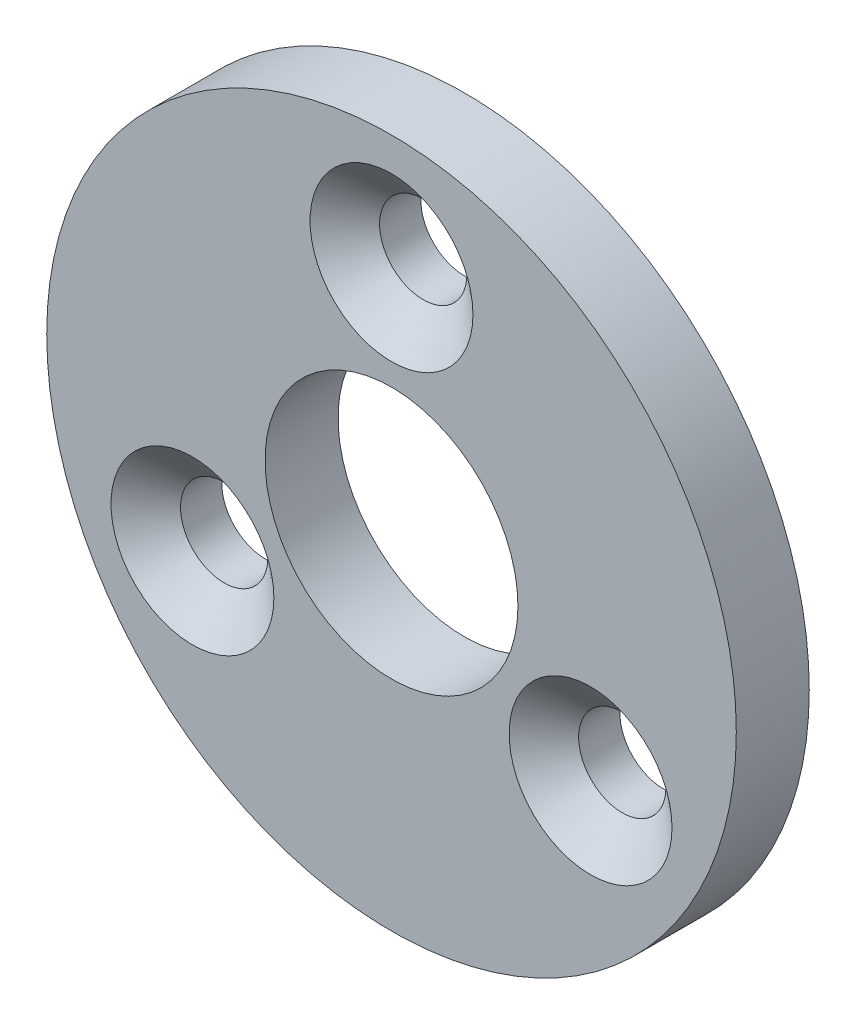
ISO-10303-21;
HEADER;
FILE_DESCRIPTION(('STEP AP214'),'2;1');
FILE_NAME('part.step','',(''),(''),'','','');
FILE_SCHEMA(('AUTOMOTIVE_DESIGN { 1 0 10303 214 1 1 1 1 }'));
ENDSEC;
DATA;
#1=APPLICATION_CONTEXT('core data for automotive mechanical design processes');
#2=APPLICATION_PROTOCOL_DEFINITION('international standard','automotive_design',2000,#1);
#3=PRODUCT_CONTEXT('',#1,'mechanical');
#4=PRODUCT('Part','Part','',(#3));
#5=PRODUCT_RELATED_PRODUCT_CATEGORY('part','',(#4));
#6=PRODUCT_DEFINITION_FORMATION('','',#4);
#7=PRODUCT_DEFINITION_CONTEXT('part definition',#1,'design');
#8=PRODUCT_DEFINITION('design','',#6,#7);
#9=PRODUCT_DEFINITION_SHAPE('','',#8);
#10=(LENGTH_UNIT() NAMED_UNIT(*) SI_UNIT(.MILLI.,.METRE.));
#11=(NAMED_UNIT(*) PLANE_ANGLE_UNIT() SI_UNIT($,.RADIAN.));
#12=(NAMED_UNIT(*) SI_UNIT($,.STERADIAN.) SOLID_ANGLE_UNIT());
#13=UNCERTAINTY_MEASURE_WITH_UNIT(LENGTH_MEASURE(1.E-05),#10,'distance_accuracy_value','');
#14=(GEOMETRIC_REPRESENTATION_CONTEXT(3) GLOBAL_UNCERTAINTY_ASSIGNED_CONTEXT((#13)) GLOBAL_UNIT_ASSIGNED_CONTEXT((#10,
#11,#12)) REPRESENTATION_CONTEXT('',''));
#15=CARTESIAN_POINT('',(0.,0.,0.));
#16=DIRECTION('',(0.,0.,1.));
#17=DIRECTION('',(1.,0.,0.));
#18=AXIS2_PLACEMENT_3D('',#15,#16,#17);
#19=CARTESIAN_POINT('',(0.,0.,3.175));
#20=DIRECTION('',(0.,0.,1.));
#21=DIRECTION('',(1.,0.,0.));
#22=AXIS2_PLACEMENT_3D('',#19,#20,#21);
#23=PLANE('',#22);
#24=CARTESIAN_POINT('',(0.,10.,3.175));
#25=DIRECTION('',(0.,0.,1.));
#26=DIRECTION('',(1.,0.,0.));
#27=AXIS2_PLACEMENT_3D('',#24,#25,#26);
#28=CIRCLE('',#27,3.5433);
#29=CARTESIAN_POINT('',(3.5433,10.,3.175));
#30=VERTEX_POINT('',#29);
#31=EDGE_CURVE('E72',#30,#30,#28,.T.);
#32=ORIENTED_EDGE('',*,*,#31,.F.);
#33=EDGE_LOOP('',(#32));
#34=FACE_BOUND('',#33,.T.);
#35=CARTESIAN_POINT('',(-8.6602540378444,-4.99999999999998,3.175));
#36=DIRECTION('',(0.,0.,1.));
#37=DIRECTION('',(1.,0.,0.));
#38=AXIS2_PLACEMENT_3D('',#35,#36,#37);
#39=CIRCLE('',#38,3.5433);
#40=CARTESIAN_POINT('',(-5.1169540378444,-4.99999999999998,3.175));
#41=VERTEX_POINT('',#40);
#42=EDGE_CURVE('E63',#41,#41,#39,.T.);
#43=ORIENTED_EDGE('',*,*,#42,.F.);
#44=EDGE_LOOP('',(#43));
#45=FACE_BOUND('',#44,.T.);
#46=CARTESIAN_POINT('',(8.6602540378444,-4.99999999999998,3.175));
#47=DIRECTION('',(0.,0.,1.));
#48=DIRECTION('',(1.,0.,0.));
#49=AXIS2_PLACEMENT_3D('',#46,#47,#48);
#50=CIRCLE('',#49,3.5433);
#51=CARTESIAN_POINT('',(12.2035540378444,-4.99999999999998,3.175));
#52=VERTEX_POINT('',#51);
#53=EDGE_CURVE('E54',#52,#52,#50,.T.);
#54=ORIENTED_EDGE('',*,*,#53,.F.);
#55=EDGE_LOOP('',(#54));
#56=FACE_BOUND('',#55,.T.);
#57=CARTESIAN_POINT('',(0.,0.,3.175));
#58=DIRECTION('',(0.,0.,1.));
#59=DIRECTION('',(1.,0.,0.));
#60=AXIS2_PLACEMENT_3D('',#57,#58,#59);
#61=CIRCLE('',#60,15.);
#62=CARTESIAN_POINT('',(15.,0.,3.175));
#63=VERTEX_POINT('',#62);
#64=EDGE_CURVE('E10',#63,#63,#61,.T.);
#65=ORIENTED_EDGE('',*,*,#64,.T.);
#66=EDGE_LOOP('',(#65));
#67=FACE_BOUND('',#66,.T.);
#68=CARTESIAN_POINT('',(0.,0.,3.175));
#69=DIRECTION('',(0.,0.,1.));
#70=DIRECTION('',(1.,0.,0.));
#71=AXIS2_PLACEMENT_3D('',#68,#69,#70);
#72=CIRCLE('',#71,5.5);
#73=CARTESIAN_POINT('',(5.5,0.,3.175));
#74=VERTEX_POINT('',#73);
#75=EDGE_CURVE('E41',#74,#74,#72,.T.);
#76=ORIENTED_EDGE('',*,*,#75,.F.);
#77=EDGE_LOOP('',(#76));
#78=FACE_BOUND('',#77,.T.);
#79=ADVANCED_FACE('F30',(#34,#45,#56,#67,#78),#23,.T.);
#80=CARTESIAN_POINT('',(0.,0.,0.));
#81=DIRECTION('',(0.,0.,1.));
#82=DIRECTION('',(1.,0.,0.));
#83=AXIS2_PLACEMENT_3D('',#80,#81,#82);
#84=PLANE('',#83);
#85=CARTESIAN_POINT('',(0.,10.,0.));
#86=DIRECTION('',(0.,0.,1.));
#87=DIRECTION('',(1.,0.,0.));
#88=AXIS2_PLACEMENT_3D('',#85,#86,#87);
#89=CIRCLE('',#88,1.89865);
#90=CARTESIAN_POINT('',(1.89865,10.,0.));
#91=VERTEX_POINT('',#90);
#92=EDGE_CURVE('E66',#91,#91,#89,.T.);
#93=ORIENTED_EDGE('',*,*,#92,.T.);
#94=EDGE_LOOP('',(#93));
#95=FACE_BOUND('',#94,.T.);
#96=CARTESIAN_POINT('',(-8.6602540378444,-4.99999999999998,0.));
#97=DIRECTION('',(0.,0.,1.));
#98=DIRECTION('',(1.,0.,0.));
#99=AXIS2_PLACEMENT_3D('',#96,#97,#98);
#100=CIRCLE('',#99,1.89865);
#101=CARTESIAN_POINT('',(-6.7616040378444,-4.99999999999998,0.));
#102=VERTEX_POINT('',#101);
#103=EDGE_CURVE('E57',#102,#102,#100,.T.);
#104=ORIENTED_EDGE('',*,*,#103,.T.);
#105=EDGE_LOOP('',(#104));
#106=FACE_BOUND('',#105,.T.);
#107=CARTESIAN_POINT('',(8.6602540378444,-4.99999999999998,0.));
#108=DIRECTION('',(0.,0.,1.));
#109=DIRECTION('',(1.,0.,0.));
#110=AXIS2_PLACEMENT_3D('',#107,#108,#109);
#111=CIRCLE('',#110,1.89865);
#112=CARTESIAN_POINT('',(10.5589040378444,-4.99999999999998,0.));
#113=VERTEX_POINT('',#112);
#114=EDGE_CURVE('E46',#113,#113,#111,.T.);
#115=ORIENTED_EDGE('',*,*,#114,.T.);
#116=EDGE_LOOP('',(#115));
#117=FACE_BOUND('',#116,.T.);
#118=CARTESIAN_POINT('',(0.,0.,0.));
#119=DIRECTION('',(0.,0.,1.));
#120=DIRECTION('',(1.,0.,0.));
#121=AXIS2_PLACEMENT_3D('',#118,#119,#120);
#122=CIRCLE('',#121,15.);
#123=CARTESIAN_POINT('',(15.,0.,0.));
#124=VERTEX_POINT('',#123);
#125=EDGE_CURVE('E34',#124,#124,#122,.T.);
#126=ORIENTED_EDGE('',*,*,#125,.F.);
#127=EDGE_LOOP('',(#126));
#128=FACE_BOUND('',#127,.T.);
#129=CARTESIAN_POINT('',(0.,0.,0.));
#130=DIRECTION('',(0.,0.,1.));
#131=DIRECTION('',(1.,0.,0.));
#132=AXIS2_PLACEMENT_3D('',#129,#130,#131);
#133=CIRCLE('',#132,5.5);
#134=CARTESIAN_POINT('',(5.5,0.,0.));
#135=VERTEX_POINT('',#134);
#136=EDGE_CURVE('E43',#135,#135,#133,.T.);
#137=ORIENTED_EDGE('',*,*,#136,.T.);
#138=EDGE_LOOP('',(#137));
#139=FACE_BOUND('',#138,.T.);
#140=ADVANCED_FACE('F80',(#95,#106,#117,#128,#139),#84,.F.);
#141=CARTESIAN_POINT('',(0.,0.,3.175));
#142=DIRECTION('',(0.,0.,-1.));
#143=DIRECTION('',(-1.,0.,0.));
#144=AXIS2_PLACEMENT_3D('',#141,#142,#143);
#145=CYLINDRICAL_SURFACE('',#144,15.);
#146=ORIENTED_EDGE('',*,*,#64,.F.);
#147=EDGE_LOOP('',(#146));
#148=FACE_BOUND('',#147,.T.);
#149=ORIENTED_EDGE('',*,*,#125,.T.);
#150=EDGE_LOOP('',(#149));
#151=FACE_BOUND('',#150,.T.);
#152=ADVANCED_FACE('F32',(#148,#151),#145,.T.);
#153=CARTESIAN_POINT('',(0.,0.,3.175));
#154=DIRECTION('',(0.,0.,-1.));
#155=DIRECTION('',(-1.,0.,0.));
#156=AXIS2_PLACEMENT_3D('',#153,#154,#155);
#157=CYLINDRICAL_SURFACE('',#156,5.5);
#158=ORIENTED_EDGE('',*,*,#75,.T.);
#159=EDGE_LOOP('',(#158));
#160=FACE_BOUND('',#159,.T.);
#161=ORIENTED_EDGE('',*,*,#136,.F.);
#162=EDGE_LOOP('',(#161));
#163=FACE_BOUND('',#162,.T.);
#164=ADVANCED_FACE('F88',(#160,#163),#157,.F.);
#165=CARTESIAN_POINT('',(8.6602540378444,-4.99999999999998,3.175));
#166=DIRECTION('',(0.,0.,1.));
#167=DIRECTION('',(1.,0.,0.));
#168=AXIS2_PLACEMENT_3D('',#165,#166,#167);
#169=CYLINDRICAL_SURFACE('',#168,1.89865);
#170=ORIENTED_EDGE('',*,*,#114,.F.);
#171=EDGE_LOOP('',(#170));
#172=FACE_BOUND('',#171,.T.);
#173=CARTESIAN_POINT('',(8.6602540378444,-4.99999999999998,1.79497479158429));
#174=DIRECTION('',(0.,0.,1.));
#175=DIRECTION('',(1.,0.,0.));
#176=AXIS2_PLACEMENT_3D('',#173,#174,#175);
#177=CIRCLE('',#176,1.89865);
#178=CARTESIAN_POINT('',(10.5589040378444,-4.99999999999998,1.79497479158429));
#179=VERTEX_POINT('',#178);
#180=EDGE_CURVE('E51',#179,#179,#177,.T.);
#181=ORIENTED_EDGE('',*,*,#180,.T.);
#182=EDGE_LOOP('',(#181));
#183=FACE_BOUND('',#182,.T.);
#184=ADVANCED_FACE('F91',(#172,#183),#169,.F.);
#185=CARTESIAN_POINT('',(8.6602540378444,-4.99999999999998,3.175));
#186=DIRECTION('',(0.,0.,1.));
#187=DIRECTION('',(1.,0.,0.));
#188=AXIS2_PLACEMENT_3D('',#185,#186,#187);
#189=CONICAL_SURFACE('',#188,3.5433,0.872664625997165);
#190=ORIENTED_EDGE('',*,*,#180,.F.);
#191=EDGE_LOOP('',(#190));
#192=FACE_BOUND('',#191,.T.);
#193=ORIENTED_EDGE('',*,*,#53,.T.);
#194=EDGE_LOOP('',(#193));
#195=FACE_BOUND('',#194,.T.);
#196=ADVANCED_FACE('F105',(#192,#195),#189,.F.);
#197=CARTESIAN_POINT('',(-8.6602540378444,-4.99999999999998,3.175));
#198=DIRECTION('',(0.,0.,1.));
#199=DIRECTION('',(1.,0.,0.));
#200=AXIS2_PLACEMENT_3D('',#197,#198,#199);
#201=CYLINDRICAL_SURFACE('',#200,1.89865);
#202=ORIENTED_EDGE('',*,*,#103,.F.);
#203=EDGE_LOOP('',(#202));
#204=FACE_BOUND('',#203,.T.);
#205=CARTESIAN_POINT('',(-8.6602540378444,-4.99999999999998,1.79497479158429));
#206=DIRECTION('',(0.,0.,1.));
#207=DIRECTION('',(1.,0.,0.));
#208=AXIS2_PLACEMENT_3D('',#205,#206,#207);
#209=CIRCLE('',#208,1.89865);
#210=CARTESIAN_POINT('',(-6.7616040378444,-4.99999999999998,1.79497479158429));
#211=VERTEX_POINT('',#210);
#212=EDGE_CURVE('E60',#211,#211,#209,.T.);
#213=ORIENTED_EDGE('',*,*,#212,.T.);
#214=EDGE_LOOP('',(#213));
#215=FACE_BOUND('',#214,.T.);
#216=ADVANCED_FACE('F109',(#204,#215),#201,.F.);
#217=CARTESIAN_POINT('',(-8.6602540378444,-4.99999999999998,3.175));
#218=DIRECTION('',(0.,0.,1.));
#219=DIRECTION('',(1.,0.,0.));
#220=AXIS2_PLACEMENT_3D('',#217,#218,#219);
#221=CONICAL_SURFACE('',#220,3.5433,0.872664625997165);
#222=ORIENTED_EDGE('',*,*,#212,.F.);
#223=EDGE_LOOP('',(#222));
#224=FACE_BOUND('',#223,.T.);
#225=ORIENTED_EDGE('',*,*,#42,.T.);
#226=EDGE_LOOP('',(#225));
#227=FACE_BOUND('',#226,.T.);
#228=ADVANCED_FACE('F113',(#224,#227),#221,.F.);
#229=CARTESIAN_POINT('',(0.,10.,3.175));
#230=DIRECTION('',(0.,0.,1.));
#231=DIRECTION('',(1.,0.,0.));
#232=AXIS2_PLACEMENT_3D('',#229,#230,#231);
#233=CYLINDRICAL_SURFACE('',#232,1.89865);
#234=ORIENTED_EDGE('',*,*,#92,.F.);
#235=EDGE_LOOP('',(#234));
#236=FACE_BOUND('',#235,.T.);
#237=CARTESIAN_POINT('',(0.,10.,1.79497479158429));
#238=DIRECTION('',(0.,0.,1.));
#239=DIRECTION('',(1.,0.,0.));
#240=AXIS2_PLACEMENT_3D('',#237,#238,#239);
#241=CIRCLE('',#240,1.89865);
#242=CARTESIAN_POINT('',(1.89865,10.,1.79497479158429));
#243=VERTEX_POINT('',#242);
#244=EDGE_CURVE('E69',#243,#243,#241,.T.);
#245=ORIENTED_EDGE('',*,*,#244,.T.);
#246=EDGE_LOOP('',(#245));
#247=FACE_BOUND('',#246,.T.);
#248=ADVANCED_FACE('F117',(#236,#247),#233,.F.);
#249=CARTESIAN_POINT('',(0.,10.,3.175));
#250=DIRECTION('',(0.,0.,1.));
#251=DIRECTION('',(1.,0.,0.));
#252=AXIS2_PLACEMENT_3D('',#249,#250,#251);
#253=CONICAL_SURFACE('',#252,3.5433,0.872664625997165);
#254=ORIENTED_EDGE('',*,*,#244,.F.);
#255=EDGE_LOOP('',(#254));
#256=FACE_BOUND('',#255,.T.);
#257=ORIENTED_EDGE('',*,*,#31,.T.);
#258=EDGE_LOOP('',(#257));
#259=FACE_BOUND('',#258,.T.);
#260=ADVANCED_FACE('F76',(#256,#259),#253,.F.);
#261=CLOSED_SHELL('',(#79,#140,#152,#164,#184,#196,#216,#228,#248,#260));
#262=MANIFOLD_SOLID_BREP('B2',#261);
#263=ADVANCED_BREP_SHAPE_REPRESENTATION('',(#18,#262),#14);
#264=SHAPE_DEFINITION_REPRESENTATION(#9,#263);
ENDSEC;
END-ISO-10303-21;
